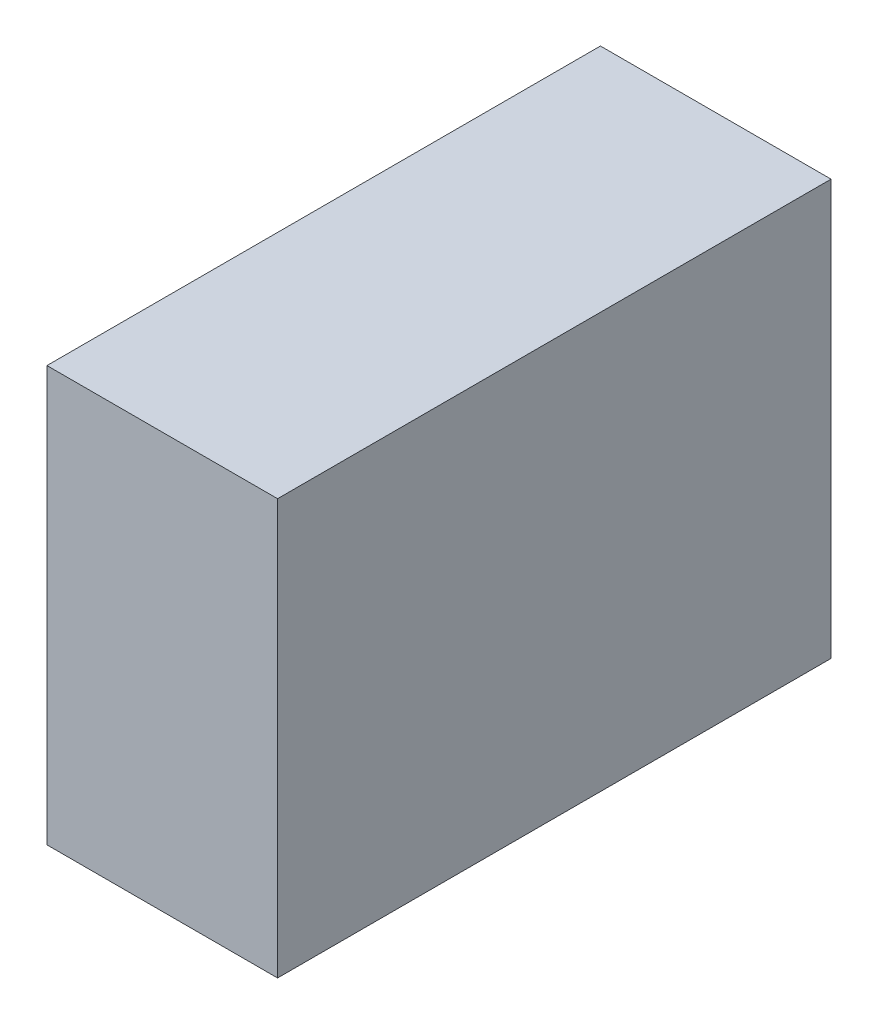
ISO-10303-21;
HEADER;
FILE_DESCRIPTION(('STEP AP214'),'2;1');
FILE_NAME('part.step','',(''),(''),'','','');
FILE_SCHEMA(('AUTOMOTIVE_DESIGN { 1 0 10303 214 1 1 1 1 }'));
ENDSEC;
DATA;
#1=APPLICATION_CONTEXT('core data for automotive mechanical design processes');
#2=APPLICATION_PROTOCOL_DEFINITION('international standard','automotive_design',2000,#1);
#3=PRODUCT_CONTEXT('',#1,'mechanical');
#4=PRODUCT('Part','Part','',(#3));
#5=PRODUCT_RELATED_PRODUCT_CATEGORY('part','',(#4));
#6=PRODUCT_DEFINITION_FORMATION('','',#4);
#7=PRODUCT_DEFINITION_CONTEXT('part definition',#1,'design');
#8=PRODUCT_DEFINITION('design','',#6,#7);
#9=PRODUCT_DEFINITION_SHAPE('','',#8);
#10=(LENGTH_UNIT() NAMED_UNIT(*) SI_UNIT(.MILLI.,.METRE.));
#11=(NAMED_UNIT(*) PLANE_ANGLE_UNIT() SI_UNIT($,.RADIAN.));
#12=(NAMED_UNIT(*) SI_UNIT($,.STERADIAN.) SOLID_ANGLE_UNIT());
#13=UNCERTAINTY_MEASURE_WITH_UNIT(LENGTH_MEASURE(1.E-05),#10,'distance_accuracy_value','');
#14=(GEOMETRIC_REPRESENTATION_CONTEXT(3) GLOBAL_UNCERTAINTY_ASSIGNED_CONTEXT((#13)) GLOBAL_UNIT_ASSIGNED_CONTEXT((#10,
#11,#12)) REPRESENTATION_CONTEXT('',''));
#15=CARTESIAN_POINT('',(0.,0.,0.));
#16=DIRECTION('',(0.,0.,1.));
#17=DIRECTION('',(1.,0.,0.));
#18=AXIS2_PLACEMENT_3D('',#15,#16,#17);
#19=CARTESIAN_POINT('',(0.,0.,120.));
#20=DIRECTION('',(1.,0.,0.));
#21=DIRECTION('',(0.,1.,0.));
#22=AXIS2_PLACEMENT_3D('',#19,#20,#21);
#23=PLANE('',#22);
#24=DIRECTION('',(0.,-1.,0.));
#25=VECTOR('',#24,1.);
#26=CARTESIAN_POINT('',(0.,0.,0.));
#27=LINE('',#26,#25);
#28=CARTESIAN_POINT('',(0.,90.,0.));
#29=VERTEX_POINT('',#28);
#30=CARTESIAN_POINT('',(0.,0.,0.));
#31=VERTEX_POINT('',#30);
#32=EDGE_CURVE('E100',#29,#31,#27,.T.);
#33=ORIENTED_EDGE('',*,*,#32,.T.);
#34=DIRECTION('',(0.,0.,-1.));
#35=VECTOR('',#34,1.);
#36=CARTESIAN_POINT('',(0.,0.,120.));
#37=LINE('',#36,#35);
#38=CARTESIAN_POINT('',(0.,0.,120.));
#39=VERTEX_POINT('',#38);
#40=EDGE_CURVE('E11',#39,#31,#37,.T.);
#41=ORIENTED_EDGE('',*,*,#40,.F.);
#42=DIRECTION('',(0.,-1.,0.));
#43=VECTOR('',#42,1.);
#44=CARTESIAN_POINT('',(0.,0.,120.));
#45=LINE('',#44,#43);
#46=CARTESIAN_POINT('',(0.,90.,120.));
#47=VERTEX_POINT('',#46);
#48=EDGE_CURVE('E88',#47,#39,#45,.T.);
#49=ORIENTED_EDGE('',*,*,#48,.F.);
#50=DIRECTION('',(0.,0.,-1.));
#51=VECTOR('',#50,1.);
#52=CARTESIAN_POINT('',(0.,90.,120.));
#53=LINE('',#52,#51);
#54=EDGE_CURVE('E96',#47,#29,#53,.T.);
#55=ORIENTED_EDGE('',*,*,#54,.T.);
#56=EDGE_LOOP('',(#33,#41,#49,#55));
#57=FACE_BOUND('',#56,.T.);
#58=ADVANCED_FACE('F37',(#57),#23,.F.);
#59=CARTESIAN_POINT('',(0.,0.,120.));
#60=DIRECTION('',(0.,1.,0.));
#61=DIRECTION('',(0.,0.,1.));
#62=AXIS2_PLACEMENT_3D('',#59,#60,#61);
#63=PLANE('',#62);
#64=DIRECTION('',(1.,0.,0.));
#65=VECTOR('',#64,1.);
#66=CARTESIAN_POINT('',(0.,0.,0.));
#67=LINE('',#66,#65);
#68=CARTESIAN_POINT('',(50.,0.,0.));
#69=VERTEX_POINT('',#68);
#70=EDGE_CURVE('E92',#31,#69,#67,.T.);
#71=ORIENTED_EDGE('',*,*,#70,.T.);
#72=DIRECTION('',(0.,0.,-1.));
#73=VECTOR('',#72,1.);
#74=CARTESIAN_POINT('',(50.,0.,120.));
#75=LINE('',#74,#73);
#76=CARTESIAN_POINT('',(50.,0.,120.));
#77=VERTEX_POINT('',#76);
#78=EDGE_CURVE('E45',#77,#69,#75,.T.);
#79=ORIENTED_EDGE('',*,*,#78,.F.);
#80=DIRECTION('',(1.,0.,0.));
#81=VECTOR('',#80,1.);
#82=CARTESIAN_POINT('',(0.,0.,120.));
#83=LINE('',#82,#81);
#84=EDGE_CURVE('E83',#39,#77,#83,.T.);
#85=ORIENTED_EDGE('',*,*,#84,.F.);
#86=ORIENTED_EDGE('',*,*,#40,.T.);
#87=EDGE_LOOP('',(#71,#79,#85,#86));
#88=FACE_BOUND('',#87,.T.);
#89=ADVANCED_FACE('F91',(#88),#63,.F.);
#90=CARTESIAN_POINT('',(50.,0.,120.));
#91=DIRECTION('',(-1.,0.,0.));
#92=DIRECTION('',(0.,-1.,0.));
#93=AXIS2_PLACEMENT_3D('',#90,#91,#92);
#94=PLANE('',#93);
#95=DIRECTION('',(0.,1.,0.));
#96=VECTOR('',#95,1.);
#97=CARTESIAN_POINT('',(50.,0.,0.));
#98=LINE('',#97,#96);
#99=CARTESIAN_POINT('',(50.,90.,0.));
#100=VERTEX_POINT('',#99);
#101=EDGE_CURVE('E70',#69,#100,#98,.T.);
#102=ORIENTED_EDGE('',*,*,#101,.T.);
#103=DIRECTION('',(0.,0.,-1.));
#104=VECTOR('',#103,1.);
#105=CARTESIAN_POINT('',(50.,90.,120.));
#106=LINE('',#105,#104);
#107=CARTESIAN_POINT('',(50.,90.,120.));
#108=VERTEX_POINT('',#107);
#109=EDGE_CURVE('E93',#108,#100,#106,.T.);
#110=ORIENTED_EDGE('',*,*,#109,.F.);
#111=DIRECTION('',(0.,1.,0.));
#112=VECTOR('',#111,1.);
#113=CARTESIAN_POINT('',(50.,0.,120.));
#114=LINE('',#113,#112);
#115=EDGE_CURVE('E86',#77,#108,#114,.T.);
#116=ORIENTED_EDGE('',*,*,#115,.F.);
#117=ORIENTED_EDGE('',*,*,#78,.T.);
#118=EDGE_LOOP('',(#102,#110,#116,#117));
#119=FACE_BOUND('',#118,.T.);
#120=ADVANCED_FACE('F94',(#119),#94,.F.);
#121=CARTESIAN_POINT('',(0.,90.,120.));
#122=DIRECTION('',(0.,-1.,0.));
#123=DIRECTION('',(0.,0.,-1.));
#124=AXIS2_PLACEMENT_3D('',#121,#122,#123);
#125=PLANE('',#124);
#126=DIRECTION('',(-1.,0.,0.));
#127=VECTOR('',#126,1.);
#128=CARTESIAN_POINT('',(0.,90.,0.));
#129=LINE('',#128,#127);
#130=EDGE_CURVE('E76',#100,#29,#129,.T.);
#131=ORIENTED_EDGE('',*,*,#130,.T.);
#132=ORIENTED_EDGE('',*,*,#54,.F.);
#133=DIRECTION('',(-1.,0.,0.));
#134=VECTOR('',#133,1.);
#135=CARTESIAN_POINT('',(0.,90.,120.));
#136=LINE('',#135,#134);
#137=EDGE_CURVE('E53',#108,#47,#136,.T.);
#138=ORIENTED_EDGE('',*,*,#137,.F.);
#139=ORIENTED_EDGE('',*,*,#109,.T.);
#140=EDGE_LOOP('',(#131,#132,#138,#139));
#141=FACE_BOUND('',#140,.T.);
#142=ADVANCED_FACE('F107',(#141),#125,.F.);
#143=CARTESIAN_POINT('',(0.,0.,120.));
#144=DIRECTION('',(0.,0.,-1.));
#145=DIRECTION('',(-1.,0.,0.));
#146=AXIS2_PLACEMENT_3D('',#143,#144,#145);
#147=PLANE('',#146);
#148=ORIENTED_EDGE('',*,*,#48,.T.);
#149=ORIENTED_EDGE('',*,*,#84,.T.);
#150=ORIENTED_EDGE('',*,*,#115,.T.);
#151=ORIENTED_EDGE('',*,*,#137,.T.);
#152=EDGE_LOOP('',(#148,#149,#150,#151));
#153=FACE_BOUND('',#152,.T.);
#154=ADVANCED_FACE('F84',(#153),#147,.F.);
#155=CARTESIAN_POINT('',(0.,0.,0.));
#156=DIRECTION('',(0.,0.,-1.));
#157=DIRECTION('',(-1.,0.,0.));
#158=AXIS2_PLACEMENT_3D('',#155,#156,#157);
#159=PLANE('',#158);
#160=ORIENTED_EDGE('',*,*,#32,.F.);
#161=ORIENTED_EDGE('',*,*,#130,.F.);
#162=ORIENTED_EDGE('',*,*,#101,.F.);
#163=ORIENTED_EDGE('',*,*,#70,.F.);
#164=EDGE_LOOP('',(#160,#161,#162,#163));
#165=FACE_BOUND('',#164,.T.);
#166=ADVANCED_FACE('F110',(#165),#159,.T.);
#167=CLOSED_SHELL('',(#58,#89,#120,#142,#154,#166));
#168=MANIFOLD_SOLID_BREP('B2',#167);
#169=ADVANCED_BREP_SHAPE_REPRESENTATION('',(#18,#168),#14);
#170=SHAPE_DEFINITION_REPRESENTATION(#9,#169);
ENDSEC;
END-ISO-10303-21;
